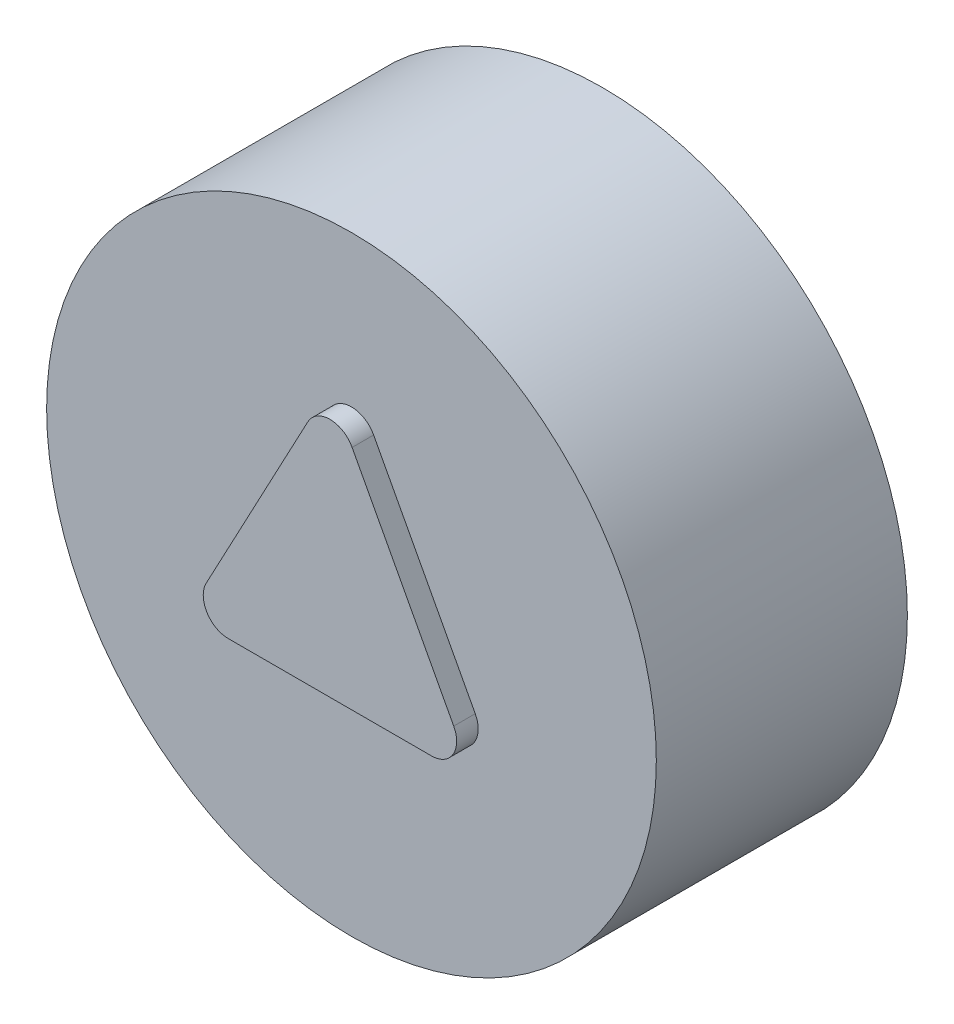
ISO-10303-21;
HEADER;
FILE_DESCRIPTION(('STEP AP214'),'2;1');
FILE_NAME('part.step','',(''),(''),'','','');
FILE_SCHEMA(('AUTOMOTIVE_DESIGN { 1 0 10303 214 1 1 1 1 }'));
ENDSEC;
DATA;
#1=APPLICATION_CONTEXT('core data for automotive mechanical design processes');
#2=APPLICATION_PROTOCOL_DEFINITION('international standard','automotive_design',2000,#1);
#3=PRODUCT_CONTEXT('',#1,'mechanical');
#4=PRODUCT('Part','Part','',(#3));
#5=PRODUCT_RELATED_PRODUCT_CATEGORY('part','',(#4));
#6=PRODUCT_DEFINITION_FORMATION('','',#4);
#7=PRODUCT_DEFINITION_CONTEXT('part definition',#1,'design');
#8=PRODUCT_DEFINITION('design','',#6,#7);
#9=PRODUCT_DEFINITION_SHAPE('','',#8);
#10=(LENGTH_UNIT() NAMED_UNIT(*) SI_UNIT(.MILLI.,.METRE.));
#11=(NAMED_UNIT(*) PLANE_ANGLE_UNIT() SI_UNIT($,.RADIAN.));
#12=(NAMED_UNIT(*) SI_UNIT($,.STERADIAN.) SOLID_ANGLE_UNIT());
#13=UNCERTAINTY_MEASURE_WITH_UNIT(LENGTH_MEASURE(1.E-05),#10,'distance_accuracy_value','');
#14=(GEOMETRIC_REPRESENTATION_CONTEXT(3) GLOBAL_UNCERTAINTY_ASSIGNED_CONTEXT((#13)) GLOBAL_UNIT_ASSIGNED_CONTEXT((#10,
#11,#12)) REPRESENTATION_CONTEXT('',''));
#15=CARTESIAN_POINT('',(0.,0.,0.));
#16=DIRECTION('',(0.,0.,1.));
#17=DIRECTION('',(1.,0.,0.));
#18=AXIS2_PLACEMENT_3D('',#15,#16,#17);
#19=CARTESIAN_POINT('',(0.,0.,7.));
#20=DIRECTION('',(0.,0.,-1.));
#21=DIRECTION('',(-1.,0.,0.));
#22=AXIS2_PLACEMENT_3D('',#19,#20,#21);
#23=CYLINDRICAL_SURFACE('',#22,8.5);
#24=CARTESIAN_POINT('',(0.,0.,7.));
#25=DIRECTION('',(0.,0.,1.));
#26=DIRECTION('',(1.,0.,0.));
#27=AXIS2_PLACEMENT_3D('',#24,#25,#26);
#28=CIRCLE('',#27,8.5);
#29=CARTESIAN_POINT('',(8.5,0.,7.));
#30=VERTEX_POINT('',#29);
#31=EDGE_CURVE('E11',#30,#30,#28,.T.);
#32=ORIENTED_EDGE('',*,*,#31,.F.);
#33=EDGE_LOOP('',(#32));
#34=FACE_BOUND('',#33,.T.);
#35=CARTESIAN_POINT('',(0.,0.,0.));
#36=DIRECTION('',(0.,0.,1.));
#37=DIRECTION('',(1.,0.,0.));
#38=AXIS2_PLACEMENT_3D('',#35,#36,#37);
#39=CIRCLE('',#38,8.5);
#40=CARTESIAN_POINT('',(8.5,0.,0.));
#41=VERTEX_POINT('',#40);
#42=EDGE_CURVE('E36',#41,#41,#39,.T.);
#43=ORIENTED_EDGE('',*,*,#42,.T.);
#44=EDGE_LOOP('',(#43));
#45=FACE_BOUND('',#44,.T.);
#46=ADVANCED_FACE('F33',(#34,#45),#23,.T.);
#47=CARTESIAN_POINT('',(0.,0.,7.));
#48=DIRECTION('',(0.,0.,1.));
#49=DIRECTION('',(1.,0.,0.));
#50=AXIS2_PLACEMENT_3D('',#47,#48,#49);
#51=PLANE('',#50);
#52=CARTESIAN_POINT('',(2.83333333333333,-1.72412839039446,7.));
#53=DIRECTION('',(0.,0.,1.));
#54=DIRECTION('',(-1.,0.,0.));
#55=AXIS2_PLACEMENT_3D('',#52,#53,#54);
#56=CIRCLE('',#55,0.7);
#57=CARTESIAN_POINT('',(2.83333333333332,-2.42412839039446,7.));
#58=VERTEX_POINT('',#57);
#59=CARTESIAN_POINT('',(3.45098039215686,-1.39471662568857,7.));
#60=VERTEX_POINT('',#59);
#61=EDGE_CURVE('E47',#58,#60,#56,.T.);
#62=ORIENTED_EDGE('',*,*,#61,.F.);
#63=DIRECTION('',(1.,0.,0.));
#64=VECTOR('',#63,1.);
#65=CARTESIAN_POINT('',(2.83333333333332,-2.42412839039446,7.));
#66=LINE('',#65,#64);
#67=CARTESIAN_POINT('',(-2.83333333333332,-2.42412839039446,7.));
#68=VERTEX_POINT('',#67);
#69=EDGE_CURVE('E51',#68,#58,#66,.T.);
#70=ORIENTED_EDGE('',*,*,#69,.F.);
#71=CARTESIAN_POINT('',(-2.83333333333333,-1.72412839039446,7.));
#72=DIRECTION('',(0.,0.,1.));
#73=DIRECTION('',(1.,0.,0.));
#74=AXIS2_PLACEMENT_3D('',#71,#72,#73);
#75=CIRCLE('',#74,0.7);
#76=CARTESIAN_POINT('',(-3.45098039215686,-1.39471662568857,7.));
#77=VERTEX_POINT('',#76);
#78=EDGE_CURVE('E121',#77,#68,#75,.T.);
#79=ORIENTED_EDGE('',*,*,#78,.F.);
#80=DIRECTION('',(-0.470588235294118,-0.882352941176471,0.));
#81=VECTOR('',#80,1.);
#82=CARTESIAN_POINT('',(-3.45098039215686,-1.39471662568857,7.));
#83=LINE('',#82,#81);
#84=CARTESIAN_POINT('',(-0.617647058823535,3.91778337431141,7.));
#85=VERTEX_POINT('',#84);
#86=EDGE_CURVE('E123',#85,#77,#83,.T.);
#87=ORIENTED_EDGE('',*,*,#86,.F.);
#88=CARTESIAN_POINT('',(0.,3.58837160960554,7.));
#89=DIRECTION('',(0.,0.,1.));
#90=DIRECTION('',(-1.,0.,0.));
#91=AXIS2_PLACEMENT_3D('',#88,#89,#90);
#92=CIRCLE('',#91,0.7);
#93=CARTESIAN_POINT('',(0.617647058823535,3.91778337431141,7.));
#94=VERTEX_POINT('',#93);
#95=EDGE_CURVE('E126',#94,#85,#92,.T.);
#96=ORIENTED_EDGE('',*,*,#95,.F.);
#97=DIRECTION('',(-0.470588235294118,0.882352941176471,0.));
#98=VECTOR('',#97,1.);
#99=CARTESIAN_POINT('',(0.617647058823535,3.91778337431141,7.));
#100=LINE('',#99,#98);
#101=EDGE_CURVE('E129',#60,#94,#100,.T.);
#102=ORIENTED_EDGE('',*,*,#101,.F.);
#103=EDGE_LOOP('',(#62,#70,#79,#87,#96,#102));
#104=FACE_BOUND('',#103,.T.);
#105=ORIENTED_EDGE('',*,*,#31,.T.);
#106=EDGE_LOOP('',(#105));
#107=FACE_BOUND('',#106,.T.);
#108=ADVANCED_FACE('F156',(#104,#107),#51,.T.);
#109=CARTESIAN_POINT('',(0.,0.,0.));
#110=DIRECTION('',(0.,0.,1.));
#111=DIRECTION('',(1.,0.,0.));
#112=AXIS2_PLACEMENT_3D('',#109,#110,#111);
#113=PLANE('',#112);
#114=CARTESIAN_POINT('',(0.,0.,0.));
#115=DIRECTION('',(0.,0.,-1.));
#116=DIRECTION('',(-1.,0.,0.));
#117=AXIS2_PLACEMENT_3D('',#114,#115,#116);
#118=CIRCLE('',#117,5.8);
#119=CARTESIAN_POINT('',(-5.8,0.,0.));
#120=VERTEX_POINT('',#119);
#121=EDGE_CURVE('E139',#120,#120,#118,.T.);
#122=ORIENTED_EDGE('',*,*,#121,.F.);
#123=EDGE_LOOP('',(#122));
#124=FACE_BOUND('',#123,.T.);
#125=ORIENTED_EDGE('',*,*,#42,.F.);
#126=EDGE_LOOP('',(#125));
#127=FACE_BOUND('',#126,.T.);
#128=ADVANCED_FACE('F153',(#124,#127),#113,.F.);
#129=CARTESIAN_POINT('',(2.83333333333333,-1.72412839039446,7.6));
#130=DIRECTION('',(0.,0.,-1.));
#131=DIRECTION('',(-1.,0.,0.));
#132=AXIS2_PLACEMENT_3D('',#129,#130,#131);
#133=CYLINDRICAL_SURFACE('',#132,0.7);
#134=ORIENTED_EDGE('',*,*,#61,.T.);
#135=DIRECTION('',(0.,0.,-1.));
#136=VECTOR('',#135,1.);
#137=CARTESIAN_POINT('',(3.45098039215686,-1.39471662568857,7.6));
#138=LINE('',#137,#136);
#139=CARTESIAN_POINT('',(3.45098039215686,-1.39471662568857,7.6));
#140=VERTEX_POINT('',#139);
#141=EDGE_CURVE('E88',#140,#60,#138,.T.);
#142=ORIENTED_EDGE('',*,*,#141,.F.);
#143=CARTESIAN_POINT('',(2.83333333333333,-1.72412839039446,7.6));
#144=DIRECTION('',(0.,0.,1.));
#145=DIRECTION('',(-1.,0.,0.));
#146=AXIS2_PLACEMENT_3D('',#143,#144,#145);
#147=CIRCLE('',#146,0.7);
#148=CARTESIAN_POINT('',(2.83333333333332,-2.42412839039446,7.6));
#149=VERTEX_POINT('',#148);
#150=EDGE_CURVE('E94',#149,#140,#147,.T.);
#151=ORIENTED_EDGE('',*,*,#150,.F.);
#152=DIRECTION('',(0.,0.,-1.));
#153=VECTOR('',#152,1.);
#154=CARTESIAN_POINT('',(2.83333333333332,-2.42412839039446,7.6));
#155=LINE('',#154,#153);
#156=EDGE_CURVE('E118',#149,#58,#155,.T.);
#157=ORIENTED_EDGE('',*,*,#156,.T.);
#158=EDGE_LOOP('',(#134,#142,#151,#157));
#159=FACE_BOUND('',#158,.T.);
#160=ADVANCED_FACE('F104',(#159),#133,.T.);
#161=CARTESIAN_POINT('',(0.617647058823535,3.91778337431141,7.6));
#162=DIRECTION('',(-0.882352941176471,-0.470588235294118,0.));
#163=DIRECTION('',(0.470588235294118,-0.882352941176471,0.));
#164=AXIS2_PLACEMENT_3D('',#161,#162,#163);
#165=PLANE('',#164);
#166=ORIENTED_EDGE('',*,*,#101,.T.);
#167=DIRECTION('',(0.,0.,-1.));
#168=VECTOR('',#167,1.);
#169=CARTESIAN_POINT('',(0.617647058823535,3.91778337431141,7.6));
#170=LINE('',#169,#168);
#171=CARTESIAN_POINT('',(0.617647058823535,3.91778337431141,7.6));
#172=VERTEX_POINT('',#171);
#173=EDGE_CURVE('E90',#172,#94,#170,.T.);
#174=ORIENTED_EDGE('',*,*,#173,.F.);
#175=DIRECTION('',(-0.470588235294118,0.882352941176471,0.));
#176=VECTOR('',#175,1.);
#177=CARTESIAN_POINT('',(0.617647058823535,3.91778337431141,7.6));
#178=LINE('',#177,#176);
#179=EDGE_CURVE('E83',#140,#172,#178,.T.);
#180=ORIENTED_EDGE('',*,*,#179,.F.);
#181=ORIENTED_EDGE('',*,*,#141,.T.);
#182=EDGE_LOOP('',(#166,#174,#180,#181));
#183=FACE_BOUND('',#182,.T.);
#184=ADVANCED_FACE('F86',(#183),#165,.F.);
#185=CARTESIAN_POINT('',(0.,3.58837160960554,7.6));
#186=DIRECTION('',(0.,0.,-1.));
#187=DIRECTION('',(-1.,0.,0.));
#188=AXIS2_PLACEMENT_3D('',#185,#186,#187);
#189=CYLINDRICAL_SURFACE('',#188,0.7);
#190=ORIENTED_EDGE('',*,*,#95,.T.);
#191=DIRECTION('',(0.,0.,-1.));
#192=VECTOR('',#191,1.);
#193=CARTESIAN_POINT('',(-0.617647058823535,3.91778337431141,7.6));
#194=LINE('',#193,#192);
#195=CARTESIAN_POINT('',(-0.617647058823535,3.91778337431141,7.6));
#196=VERTEX_POINT('',#195);
#197=EDGE_CURVE('E107',#196,#85,#194,.T.);
#198=ORIENTED_EDGE('',*,*,#197,.F.);
#199=CARTESIAN_POINT('',(0.,3.58837160960554,7.6));
#200=DIRECTION('',(0.,0.,1.));
#201=DIRECTION('',(-1.,0.,0.));
#202=AXIS2_PLACEMENT_3D('',#199,#200,#201);
#203=CIRCLE('',#202,0.7);
#204=EDGE_CURVE('E93',#172,#196,#203,.T.);
#205=ORIENTED_EDGE('',*,*,#204,.F.);
#206=ORIENTED_EDGE('',*,*,#173,.T.);
#207=EDGE_LOOP('',(#190,#198,#205,#206));
#208=FACE_BOUND('',#207,.T.);
#209=ADVANCED_FACE('F174',(#208),#189,.T.);
#210=CARTESIAN_POINT('',(-3.45098039215686,-1.39471662568857,7.6));
#211=DIRECTION('',(0.882352941176471,-0.470588235294118,0.));
#212=DIRECTION('',(0.470588235294118,0.882352941176471,0.));
#213=AXIS2_PLACEMENT_3D('',#210,#211,#212);
#214=PLANE('',#213);
#215=ORIENTED_EDGE('',*,*,#86,.T.);
#216=DIRECTION('',(0.,0.,-1.));
#217=VECTOR('',#216,1.);
#218=CARTESIAN_POINT('',(-3.45098039215686,-1.39471662568857,7.6));
#219=LINE('',#218,#217);
#220=CARTESIAN_POINT('',(-3.45098039215686,-1.39471662568857,7.6));
#221=VERTEX_POINT('',#220);
#222=EDGE_CURVE('E112',#221,#77,#219,.T.);
#223=ORIENTED_EDGE('',*,*,#222,.F.);
#224=DIRECTION('',(-0.470588235294118,-0.882352941176471,0.));
#225=VECTOR('',#224,1.);
#226=CARTESIAN_POINT('',(-3.45098039215686,-1.39471662568857,7.6));
#227=LINE('',#226,#225);
#228=EDGE_CURVE('E136',#196,#221,#227,.T.);
#229=ORIENTED_EDGE('',*,*,#228,.F.);
#230=ORIENTED_EDGE('',*,*,#197,.T.);
#231=EDGE_LOOP('',(#215,#223,#229,#230));
#232=FACE_BOUND('',#231,.T.);
#233=ADVANCED_FACE('F177',(#232),#214,.F.);
#234=CARTESIAN_POINT('',(-2.83333333333333,-1.72412839039446,7.6));
#235=DIRECTION('',(0.,0.,-1.));
#236=DIRECTION('',(-1.,0.,0.));
#237=AXIS2_PLACEMENT_3D('',#234,#235,#236);
#238=CYLINDRICAL_SURFACE('',#237,0.7);
#239=ORIENTED_EDGE('',*,*,#78,.T.);
#240=DIRECTION('',(0.,0.,-1.));
#241=VECTOR('',#240,1.);
#242=CARTESIAN_POINT('',(-2.83333333333332,-2.42412839039446,7.6));
#243=LINE('',#242,#241);
#244=CARTESIAN_POINT('',(-2.83333333333332,-2.42412839039446,7.6));
#245=VERTEX_POINT('',#244);
#246=EDGE_CURVE('E115',#245,#68,#243,.T.);
#247=ORIENTED_EDGE('',*,*,#246,.F.);
#248=CARTESIAN_POINT('',(-2.83333333333333,-1.72412839039446,7.6));
#249=DIRECTION('',(0.,0.,1.));
#250=DIRECTION('',(1.,0.,0.));
#251=AXIS2_PLACEMENT_3D('',#248,#249,#250);
#252=CIRCLE('',#251,0.7);
#253=EDGE_CURVE('E134',#221,#245,#252,.T.);
#254=ORIENTED_EDGE('',*,*,#253,.F.);
#255=ORIENTED_EDGE('',*,*,#222,.T.);
#256=EDGE_LOOP('',(#239,#247,#254,#255));
#257=FACE_BOUND('',#256,.T.);
#258=ADVANCED_FACE('F181',(#257),#238,.T.);
#259=CARTESIAN_POINT('',(2.83333333333332,-2.42412839039446,7.6));
#260=DIRECTION('',(0.,1.,0.));
#261=DIRECTION('',(0.,0.,1.));
#262=AXIS2_PLACEMENT_3D('',#259,#260,#261);
#263=PLANE('',#262);
#264=ORIENTED_EDGE('',*,*,#69,.T.);
#265=ORIENTED_EDGE('',*,*,#156,.F.);
#266=DIRECTION('',(1.,0.,0.));
#267=VECTOR('',#266,1.);
#268=CARTESIAN_POINT('',(2.83333333333332,-2.42412839039446,7.6));
#269=LINE('',#268,#267);
#270=EDGE_CURVE('E99',#245,#149,#269,.T.);
#271=ORIENTED_EDGE('',*,*,#270,.F.);
#272=ORIENTED_EDGE('',*,*,#246,.T.);
#273=EDGE_LOOP('',(#264,#265,#271,#272));
#274=FACE_BOUND('',#273,.T.);
#275=ADVANCED_FACE('F185',(#274),#263,.F.);
#276=CARTESIAN_POINT('',(2.83333333333333,-1.72412839039446,7.6));
#277=DIRECTION('',(0.,0.,-1.));
#278=DIRECTION('',(-1.,0.,0.));
#279=AXIS2_PLACEMENT_3D('',#276,#277,#278);
#280=PLANE('',#279);
#281=ORIENTED_EDGE('',*,*,#150,.T.);
#282=ORIENTED_EDGE('',*,*,#179,.T.);
#283=ORIENTED_EDGE('',*,*,#204,.T.);
#284=ORIENTED_EDGE('',*,*,#228,.T.);
#285=ORIENTED_EDGE('',*,*,#253,.T.);
#286=ORIENTED_EDGE('',*,*,#270,.T.);
#287=EDGE_LOOP('',(#281,#282,#283,#284,#285,#286));
#288=FACE_BOUND('',#287,.T.);
#289=ADVANCED_FACE('F97',(#288),#280,.F.);
#290=CARTESIAN_POINT('',(0.,0.,4.15));
#291=DIRECTION('',(0.,0.,-1.));
#292=DIRECTION('',(-1.,0.,0.));
#293=AXIS2_PLACEMENT_3D('',#290,#291,#292);
#294=CYLINDRICAL_SURFACE('',#293,5.8);
#295=CARTESIAN_POINT('',(0.,0.,4.15));
#296=DIRECTION('',(0.,0.,-1.));
#297=DIRECTION('',(-1.,0.,0.));
#298=AXIS2_PLACEMENT_3D('',#295,#296,#297);
#299=CIRCLE('',#298,5.8);
#300=CARTESIAN_POINT('',(-5.8,0.,4.15));
#301=VERTEX_POINT('',#300);
#302=EDGE_CURVE('E132',#301,#301,#299,.T.);
#303=CARTESIAN_POINT('',(-5.8,0.,4.15));
#304=CARTESIAN_POINT('',(-5.8,0.,4.10677083333333));
#305=CARTESIAN_POINT('',(-5.8,0.,4.06354166666667));
#306=CARTESIAN_POINT('',(-5.8,0.,3.97708333333333));
#307=CARTESIAN_POINT('',(-5.8,0.,3.93385416666667));
#308=CARTESIAN_POINT('',(-5.8,0.,3.84739583333333));
#309=CARTESIAN_POINT('',(-5.8,0.,3.80416666666667));
#310=CARTESIAN_POINT('',(-5.8,0.,3.71770833333333));
#311=CARTESIAN_POINT('',(-5.8,0.,3.67447916666667));
#312=CARTESIAN_POINT('',(-5.8,0.,3.58802083333333));
#313=CARTESIAN_POINT('',(-5.8,0.,3.54479166666667));
#314=CARTESIAN_POINT('',(-5.8,0.,3.45833333333333));
#315=CARTESIAN_POINT('',(-5.8,0.,3.41510416666667));
#316=CARTESIAN_POINT('',(-5.8,0.,3.32864583333333));
#317=CARTESIAN_POINT('',(-5.8,0.,3.28541666666667));
#318=CARTESIAN_POINT('',(-5.8,0.,3.19895833333333));
#319=CARTESIAN_POINT('',(-5.8,0.,3.15572916666667));
#320=CARTESIAN_POINT('',(-5.8,0.,3.06927083333333));
#321=CARTESIAN_POINT('',(-5.8,0.,3.02604166666667));
#322=CARTESIAN_POINT('',(-5.8,0.,2.93958333333333));
#323=CARTESIAN_POINT('',(-5.8,0.,2.89635416666667));
#324=CARTESIAN_POINT('',(-5.8,0.,2.80989583333333));
#325=CARTESIAN_POINT('',(-5.8,0.,2.76666666666667));
#326=CARTESIAN_POINT('',(-5.8,0.,2.68020833333333));
#327=CARTESIAN_POINT('',(-5.8,0.,2.63697916666667));
#328=CARTESIAN_POINT('',(-5.8,0.,2.55052083333333));
#329=CARTESIAN_POINT('',(-5.8,0.,2.50729166666667));
#330=CARTESIAN_POINT('',(-5.8,0.,2.42083333333333));
#331=CARTESIAN_POINT('',(-5.8,0.,2.37760416666667));
#332=CARTESIAN_POINT('',(-5.8,0.,2.29114583333333));
#333=CARTESIAN_POINT('',(-5.8,0.,2.24791666666667));
#334=CARTESIAN_POINT('',(-5.8,0.,2.16145833333333));
#335=CARTESIAN_POINT('',(-5.8,0.,2.11822916666667));
#336=CARTESIAN_POINT('',(-5.8,0.,2.03177083333333));
#337=CARTESIAN_POINT('',(-5.8,0.,1.98854166666667));
#338=CARTESIAN_POINT('',(-5.8,0.,1.90208333333333));
#339=CARTESIAN_POINT('',(-5.8,0.,1.85885416666667));
#340=CARTESIAN_POINT('',(-5.8,0.,1.77239583333333));
#341=CARTESIAN_POINT('',(-5.8,0.,1.72916666666667));
#342=CARTESIAN_POINT('',(-5.8,0.,1.64270833333333));
#343=CARTESIAN_POINT('',(-5.8,0.,1.59947916666667));
#344=CARTESIAN_POINT('',(-5.8,0.,1.51302083333333));
#345=CARTESIAN_POINT('',(-5.8,0.,1.46979166666667));
#346=CARTESIAN_POINT('',(-5.8,0.,1.38333333333333));
#347=CARTESIAN_POINT('',(-5.8,0.,1.34010416666667));
#348=CARTESIAN_POINT('',(-5.8,0.,1.25364583333333));
#349=CARTESIAN_POINT('',(-5.8,0.,1.21041666666667));
#350=CARTESIAN_POINT('',(-5.8,0.,1.12395833333333));
#351=CARTESIAN_POINT('',(-5.8,0.,1.08072916666667));
#352=CARTESIAN_POINT('',(-5.8,0.,0.994270833333334));
#353=CARTESIAN_POINT('',(-5.8,0.,0.951041666666667));
#354=CARTESIAN_POINT('',(-5.8,0.,0.864583333333333));
#355=CARTESIAN_POINT('',(-5.8,0.,0.821354166666667));
#356=CARTESIAN_POINT('',(-5.8,0.,0.734895833333334));
#357=CARTESIAN_POINT('',(-5.8,0.,0.691666666666667));
#358=CARTESIAN_POINT('',(-5.8,0.,0.605208333333333));
#359=CARTESIAN_POINT('',(-5.8,0.,0.561979166666667));
#360=CARTESIAN_POINT('',(-5.8,0.,0.475520833333333));
#361=CARTESIAN_POINT('',(-5.8,0.,0.432291666666667));
#362=CARTESIAN_POINT('',(-5.8,0.,0.345833333333333));
#363=CARTESIAN_POINT('',(-5.8,0.,0.302604166666667));
#364=CARTESIAN_POINT('',(-5.8,0.,0.216145833333333));
#365=CARTESIAN_POINT('',(-5.8,0.,0.172916666666666));
#366=CARTESIAN_POINT('',(-5.8,0.,0.0864583333333331));
#367=CARTESIAN_POINT('',(-5.8,0.,0.0432291666666665));
#368=CARTESIAN_POINT('',(-5.8,0.,0.));
#369=B_SPLINE_CURVE_WITH_KNOTS('',3,(#303,#304,#305,#306,#307,#308,#309,#310,#311,#312,#313,
#314,#315,#316,#317,#318,#319,#320,#321,#322,#323,#324,#325,#326,#327,#328,#329,#330,#331,#332,
#333,#334,#335,#336,#337,#338,#339,#340,#341,#342,#343,#344,#345,#346,#347,#348,#349,#350,#351,
#352,#353,#354,#355,#356,#357,#358,#359,#360,#361,#362,#363,#364,#365,#366,#367,#368),
.UNSPECIFIED.,.F.,.F.,(4,2,2,2,2,2,2,2,2,2,2,2,2,2,2,2,2,2,2,2,2,2,2,2,2,2,2,2,2,2,2,2,4),(0.,
0.1296875,0.259375,0.3890625,0.51875,0.6484375,0.778125,0.9078125,1.0375,1.1671875,1.296875,
1.4265625,1.55625,1.6859375,1.815625,1.9453125,2.075,2.2046875,2.334375,2.4640625,2.59375,
2.7234375,2.853125,2.9828125,3.1125,3.2421875,3.371875,3.5015625,3.63125,3.7609375,3.890625,
4.0203125,4.15),.UNSPECIFIED.);
#370=EDGE_CURVE('BSEAM147',#301,#120,#369,.T.);
#371=ORIENTED_EDGE('',*,*,#302,.F.);
#372=ORIENTED_EDGE('',*,*,#121,.T.);
#373=ORIENTED_EDGE('',*,*,#370,.T.);
#374=ORIENTED_EDGE('',*,*,#370,.F.);
#375=EDGE_LOOP('',(#371,#373,#372,#374));
#376=FACE_BOUND('',#375,.T.);
#377=ADVANCED_FACE('F147',(#376),#294,.F.);
#378=CARTESIAN_POINT('',(0.,0.,4.15));
#379=DIRECTION('',(0.,0.,-1.));
#380=DIRECTION('',(-1.,0.,0.));
#381=AXIS2_PLACEMENT_3D('',#378,#379,#380);
#382=PLANE('',#381);
#383=ORIENTED_EDGE('',*,*,#302,.T.);
#384=EDGE_LOOP('',(#383));
#385=FACE_BOUND('',#384,.T.);
#386=ADVANCED_FACE('F145',(#385),#382,.T.);
#387=CLOSED_SHELL('',(#46,#108,#128,#160,#184,#209,#233,#258,#275,#289,#377,#386));
#388=MANIFOLD_SOLID_BREP('B2',#387);
#389=ADVANCED_BREP_SHAPE_REPRESENTATION('',(#18,#388),#14);
#390=SHAPE_DEFINITION_REPRESENTATION(#9,#389);
ENDSEC;
END-ISO-10303-21;
